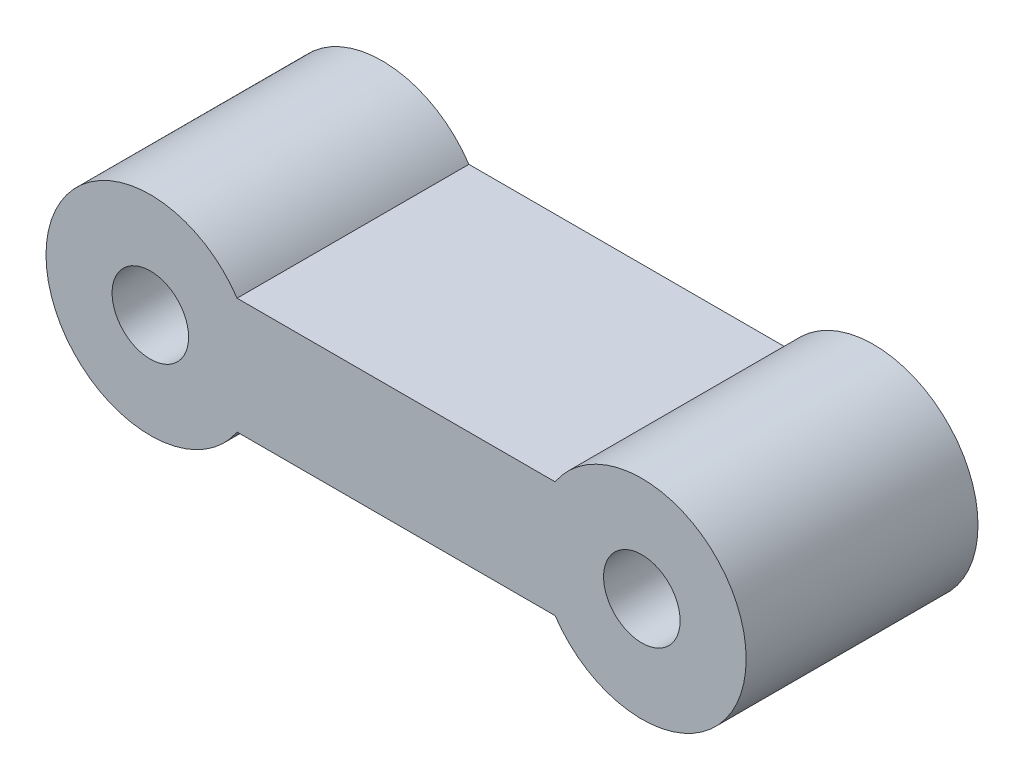
ISO-10303-21;
HEADER;
FILE_DESCRIPTION(('STEP AP214'),'2;1');
FILE_NAME('part.step','',(''),(''),'','','');
FILE_SCHEMA(('AUTOMOTIVE_DESIGN { 1 0 10303 214 1 1 1 1 }'));
ENDSEC;
DATA;
#1=APPLICATION_CONTEXT('core data for automotive mechanical design processes');
#2=APPLICATION_PROTOCOL_DEFINITION('international standard','automotive_design',2000,#1);
#3=PRODUCT_CONTEXT('',#1,'mechanical');
#4=PRODUCT('Part','Part','',(#3));
#5=PRODUCT_RELATED_PRODUCT_CATEGORY('part','',(#4));
#6=PRODUCT_DEFINITION_FORMATION('','',#4);
#7=PRODUCT_DEFINITION_CONTEXT('part definition',#1,'design');
#8=PRODUCT_DEFINITION('design','',#6,#7);
#9=PRODUCT_DEFINITION_SHAPE('','',#8);
#10=(LENGTH_UNIT() NAMED_UNIT(*) SI_UNIT(.MILLI.,.METRE.));
#11=(NAMED_UNIT(*) PLANE_ANGLE_UNIT() SI_UNIT($,.RADIAN.));
#12=(NAMED_UNIT(*) SI_UNIT($,.STERADIAN.) SOLID_ANGLE_UNIT());
#13=UNCERTAINTY_MEASURE_WITH_UNIT(LENGTH_MEASURE(1.E-05),#10,'distance_accuracy_value','');
#14=(GEOMETRIC_REPRESENTATION_CONTEXT(3) GLOBAL_UNCERTAINTY_ASSIGNED_CONTEXT((#13)) GLOBAL_UNIT_ASSIGNED_CONTEXT((#10,
#11,#12)) REPRESENTATION_CONTEXT('',''));
#15=CARTESIAN_POINT('',(0.,0.,0.));
#16=DIRECTION('',(0.,0.,1.));
#17=DIRECTION('',(1.,0.,0.));
#18=AXIS2_PLACEMENT_3D('',#15,#16,#17);
#19=CARTESIAN_POINT('',(10.6,0.,-5.));
#20=DIRECTION('',(0.,0.,1.));
#21=DIRECTION('',(1.,0.,0.));
#22=AXIS2_PLACEMENT_3D('',#19,#20,#21);
#23=CYLINDRICAL_SURFACE('',#22,1.65);
#24=CARTESIAN_POINT('',(10.6,0.,5.));
#25=DIRECTION('',(0.,0.,1.));
#26=DIRECTION('',(1.,0.,0.));
#27=AXIS2_PLACEMENT_3D('',#24,#25,#26);
#28=CIRCLE('',#27,1.65);
#29=CARTESIAN_POINT('',(12.25,0.,5.));
#30=VERTEX_POINT('',#29);
#31=EDGE_CURVE('E19',#30,#30,#28,.T.);
#32=ORIENTED_EDGE('',*,*,#31,.T.);
#33=EDGE_LOOP('',(#32));
#34=FACE_BOUND('',#33,.T.);
#35=CARTESIAN_POINT('',(10.6,0.,-5.));
#36=DIRECTION('',(0.,0.,1.));
#37=DIRECTION('',(1.,0.,0.));
#38=AXIS2_PLACEMENT_3D('',#35,#36,#37);
#39=CIRCLE('',#38,1.65);
#40=CARTESIAN_POINT('',(12.25,0.,-5.));
#41=VERTEX_POINT('',#40);
#42=EDGE_CURVE('E91',#41,#41,#39,.T.);
#43=ORIENTED_EDGE('',*,*,#42,.F.);
#44=EDGE_LOOP('',(#43));
#45=FACE_BOUND('',#44,.T.);
#46=ADVANCED_FACE('F16',(#34,#45),#23,.F.);
#47=CARTESIAN_POINT('',(-10.6,0.,-5.));
#48=DIRECTION('',(0.,0.,1.));
#49=DIRECTION('',(1.,0.,0.));
#50=AXIS2_PLACEMENT_3D('',#47,#48,#49);
#51=CYLINDRICAL_SURFACE('',#50,1.65);
#52=CARTESIAN_POINT('',(-10.6,0.,5.));
#53=DIRECTION('',(0.,0.,1.));
#54=DIRECTION('',(1.,0.,0.));
#55=AXIS2_PLACEMENT_3D('',#52,#53,#54);
#56=CIRCLE('',#55,1.65);
#57=CARTESIAN_POINT('',(-8.95,0.,5.));
#58=VERTEX_POINT('',#57);
#59=EDGE_CURVE('E64',#58,#58,#56,.T.);
#60=ORIENTED_EDGE('',*,*,#59,.T.);
#61=EDGE_LOOP('',(#60));
#62=FACE_BOUND('',#61,.T.);
#63=CARTESIAN_POINT('',(-10.6,0.,-5.));
#64=DIRECTION('',(0.,0.,1.));
#65=DIRECTION('',(1.,0.,0.));
#66=AXIS2_PLACEMENT_3D('',#63,#64,#65);
#67=CIRCLE('',#66,1.65);
#68=CARTESIAN_POINT('',(-8.95,0.,-5.));
#69=VERTEX_POINT('',#68);
#70=EDGE_CURVE('E88',#69,#69,#67,.T.);
#71=ORIENTED_EDGE('',*,*,#70,.F.);
#72=EDGE_LOOP('',(#71));
#73=FACE_BOUND('',#72,.T.);
#74=ADVANCED_FACE('F112',(#62,#73),#51,.F.);
#75=CARTESIAN_POINT('',(-10.6,0.,-5.));
#76=DIRECTION('',(0.,0.,1.));
#77=DIRECTION('',(1.,0.,0.));
#78=AXIS2_PLACEMENT_3D('',#75,#76,#77);
#79=CYLINDRICAL_SURFACE('',#78,4.5);
#80=CARTESIAN_POINT('',(-10.6,0.,5.));
#81=DIRECTION('',(0.,0.,1.));
#82=DIRECTION('',(1.,0.,0.));
#83=AXIS2_PLACEMENT_3D('',#80,#81,#82);
#84=CIRCLE('',#83,4.5);
#85=CARTESIAN_POINT('',(-6.85834261322606,-2.5,5.));
#86=VERTEX_POINT('',#85);
#87=CARTESIAN_POINT('',(-6.85834261322606,2.5,5.));
#88=VERTEX_POINT('',#87);
#89=EDGE_CURVE('E55',#86,#88,#84,.F.);
#90=ORIENTED_EDGE('',*,*,#89,.T.);
#91=DIRECTION('',(0.,0.,1.));
#92=VECTOR('',#91,1.);
#93=CARTESIAN_POINT('',(-6.85834261322606,2.5,-5.));
#94=LINE('',#93,#92);
#95=CARTESIAN_POINT('',(-6.85834261322606,2.5,-5.));
#96=VERTEX_POINT('',#95);
#97=EDGE_CURVE('E60',#96,#88,#94,.T.);
#98=ORIENTED_EDGE('',*,*,#97,.F.);
#99=CARTESIAN_POINT('',(-10.6,0.,-5.));
#100=DIRECTION('',(0.,0.,1.));
#101=DIRECTION('',(1.,0.,0.));
#102=AXIS2_PLACEMENT_3D('',#99,#100,#101);
#103=CIRCLE('',#102,4.5);
#104=CARTESIAN_POINT('',(-6.85834261322606,-2.5,-5.));
#105=VERTEX_POINT('',#104);
#106=EDGE_CURVE('E73',#105,#96,#103,.F.);
#107=ORIENTED_EDGE('',*,*,#106,.F.);
#108=DIRECTION('',(0.,0.,1.));
#109=VECTOR('',#108,1.);
#110=CARTESIAN_POINT('',(-6.85834261322606,-2.5,-5.));
#111=LINE('',#110,#109);
#112=EDGE_CURVE('E61',#105,#86,#111,.T.);
#113=ORIENTED_EDGE('',*,*,#112,.T.);
#114=EDGE_LOOP('',(#90,#98,#107,#113));
#115=FACE_BOUND('',#114,.T.);
#116=ADVANCED_FACE('F57',(#115),#79,.T.);
#117=CARTESIAN_POINT('',(0.,0.,5.));
#118=DIRECTION('',(0.,0.,-1.));
#119=DIRECTION('',(-1.,0.,0.));
#120=AXIS2_PLACEMENT_3D('',#117,#118,#119);
#121=PLANE('',#120);
#122=ORIENTED_EDGE('',*,*,#89,.F.);
#123=DIRECTION('',(1.,0.,0.));
#124=VECTOR('',#123,1.);
#125=CARTESIAN_POINT('',(0.,-2.5,5.));
#126=LINE('',#125,#124);
#127=CARTESIAN_POINT('',(6.85834261322606,-2.5,5.));
#128=VERTEX_POINT('',#127);
#129=EDGE_CURVE('E83',#86,#128,#126,.T.);
#130=ORIENTED_EDGE('',*,*,#129,.T.);
#131=CARTESIAN_POINT('',(10.6,0.,5.));
#132=DIRECTION('',(0.,0.,1.));
#133=DIRECTION('',(1.,0.,0.));
#134=AXIS2_PLACEMENT_3D('',#131,#132,#133);
#135=CIRCLE('',#134,4.5);
#136=CARTESIAN_POINT('',(6.85834261322606,2.5,5.));
#137=VERTEX_POINT('',#136);
#138=EDGE_CURVE('E71',#137,#128,#135,.F.);
#139=ORIENTED_EDGE('',*,*,#138,.F.);
#140=DIRECTION('',(1.,0.,0.));
#141=VECTOR('',#140,1.);
#142=CARTESIAN_POINT('',(0.,2.5,5.));
#143=LINE('',#142,#141);
#144=EDGE_CURVE('E67',#88,#137,#143,.T.);
#145=ORIENTED_EDGE('',*,*,#144,.F.);
#146=EDGE_LOOP('',(#122,#130,#139,#145));
#147=FACE_BOUND('',#146,.T.);
#148=ORIENTED_EDGE('',*,*,#59,.F.);
#149=EDGE_LOOP('',(#148));
#150=FACE_BOUND('',#149,.T.);
#151=ORIENTED_EDGE('',*,*,#31,.F.);
#152=EDGE_LOOP('',(#151));
#153=FACE_BOUND('',#152,.T.);
#154=ADVANCED_FACE('F68',(#147,#150,#153),#121,.F.);
#155=CARTESIAN_POINT('',(0.,-2.5,-5.));
#156=DIRECTION('',(0.,1.,0.));
#157=DIRECTION('',(0.,0.,1.));
#158=AXIS2_PLACEMENT_3D('',#155,#156,#157);
#159=PLANE('',#158);
#160=ORIENTED_EDGE('',*,*,#112,.F.);
#161=DIRECTION('',(-1.,0.,0.));
#162=VECTOR('',#161,1.);
#163=CARTESIAN_POINT('',(0.,-2.5,-5.));
#164=LINE('',#163,#162);
#165=CARTESIAN_POINT('',(6.85834261322606,-2.5,-5.));
#166=VERTEX_POINT('',#165);
#167=EDGE_CURVE('E87',#166,#105,#164,.T.);
#168=ORIENTED_EDGE('',*,*,#167,.F.);
#169=DIRECTION('',(0.,0.,1.));
#170=VECTOR('',#169,1.);
#171=CARTESIAN_POINT('',(6.85834261322606,-2.5,-5.));
#172=LINE('',#171,#170);
#173=EDGE_CURVE('E77',#128,#166,#172,.F.);
#174=ORIENTED_EDGE('',*,*,#173,.F.);
#175=ORIENTED_EDGE('',*,*,#129,.F.);
#176=EDGE_LOOP('',(#160,#168,#174,#175));
#177=FACE_BOUND('',#176,.T.);
#178=ADVANCED_FACE('F102',(#177),#159,.F.);
#179=CARTESIAN_POINT('',(0.,0.,-5.));
#180=DIRECTION('',(0.,0.,-1.));
#181=DIRECTION('',(-1.,0.,0.));
#182=AXIS2_PLACEMENT_3D('',#179,#180,#181);
#183=PLANE('',#182);
#184=ORIENTED_EDGE('',*,*,#167,.T.);
#185=ORIENTED_EDGE('',*,*,#106,.T.);
#186=DIRECTION('',(1.,0.,0.));
#187=VECTOR('',#186,1.);
#188=CARTESIAN_POINT('',(0.,2.5,-5.));
#189=LINE('',#188,#187);
#190=CARTESIAN_POINT('',(6.85834261322606,2.5,-5.));
#191=VERTEX_POINT('',#190);
#192=EDGE_CURVE('E34',#191,#96,#189,.F.);
#193=ORIENTED_EDGE('',*,*,#192,.F.);
#194=CARTESIAN_POINT('',(10.6,0.,-5.));
#195=DIRECTION('',(0.,0.,1.));
#196=DIRECTION('',(1.,0.,0.));
#197=AXIS2_PLACEMENT_3D('',#194,#195,#196);
#198=CIRCLE('',#197,4.5);
#199=EDGE_CURVE('E25',#166,#191,#198,.T.);
#200=ORIENTED_EDGE('',*,*,#199,.F.);
#201=EDGE_LOOP('',(#184,#185,#193,#200));
#202=FACE_BOUND('',#201,.T.);
#203=ORIENTED_EDGE('',*,*,#70,.T.);
#204=EDGE_LOOP('',(#203));
#205=FACE_BOUND('',#204,.T.);
#206=ORIENTED_EDGE('',*,*,#42,.T.);
#207=EDGE_LOOP('',(#206));
#208=FACE_BOUND('',#207,.T.);
#209=ADVANCED_FACE('F109',(#202,#205,#208),#183,.T.);
#210=CARTESIAN_POINT('',(0.,2.5,-5.));
#211=DIRECTION('',(0.,1.,0.));
#212=DIRECTION('',(0.,0.,1.));
#213=AXIS2_PLACEMENT_3D('',#210,#211,#212);
#214=PLANE('',#213);
#215=ORIENTED_EDGE('',*,*,#192,.T.);
#216=ORIENTED_EDGE('',*,*,#97,.T.);
#217=ORIENTED_EDGE('',*,*,#144,.T.);
#218=DIRECTION('',(0.,0.,1.));
#219=VECTOR('',#218,1.);
#220=CARTESIAN_POINT('',(6.85834261322606,2.5,-5.));
#221=LINE('',#220,#219);
#222=EDGE_CURVE('E11',#191,#137,#221,.T.);
#223=ORIENTED_EDGE('',*,*,#222,.F.);
#224=EDGE_LOOP('',(#215,#216,#217,#223));
#225=FACE_BOUND('',#224,.T.);
#226=ADVANCED_FACE('F75',(#225),#214,.T.);
#227=CARTESIAN_POINT('',(10.6,0.,-5.));
#228=DIRECTION('',(0.,0.,1.));
#229=DIRECTION('',(1.,0.,0.));
#230=AXIS2_PLACEMENT_3D('',#227,#228,#229);
#231=CYLINDRICAL_SURFACE('',#230,4.5);
#232=ORIENTED_EDGE('',*,*,#199,.T.);
#233=ORIENTED_EDGE('',*,*,#222,.T.);
#234=ORIENTED_EDGE('',*,*,#138,.T.);
#235=ORIENTED_EDGE('',*,*,#173,.T.);
#236=EDGE_LOOP('',(#232,#233,#234,#235));
#237=FACE_BOUND('',#236,.T.);
#238=ADVANCED_FACE('F114',(#237),#231,.T.);
#239=CLOSED_SHELL('',(#46,#74,#116,#154,#178,#209,#226,#238));
#240=MANIFOLD_SOLID_BREP('B1',#239);
#241=ADVANCED_BREP_SHAPE_REPRESENTATION('',(#18,#240),#14);
#242=SHAPE_DEFINITION_REPRESENTATION(#9,#241);
ENDSEC;
END-ISO-10303-21;
